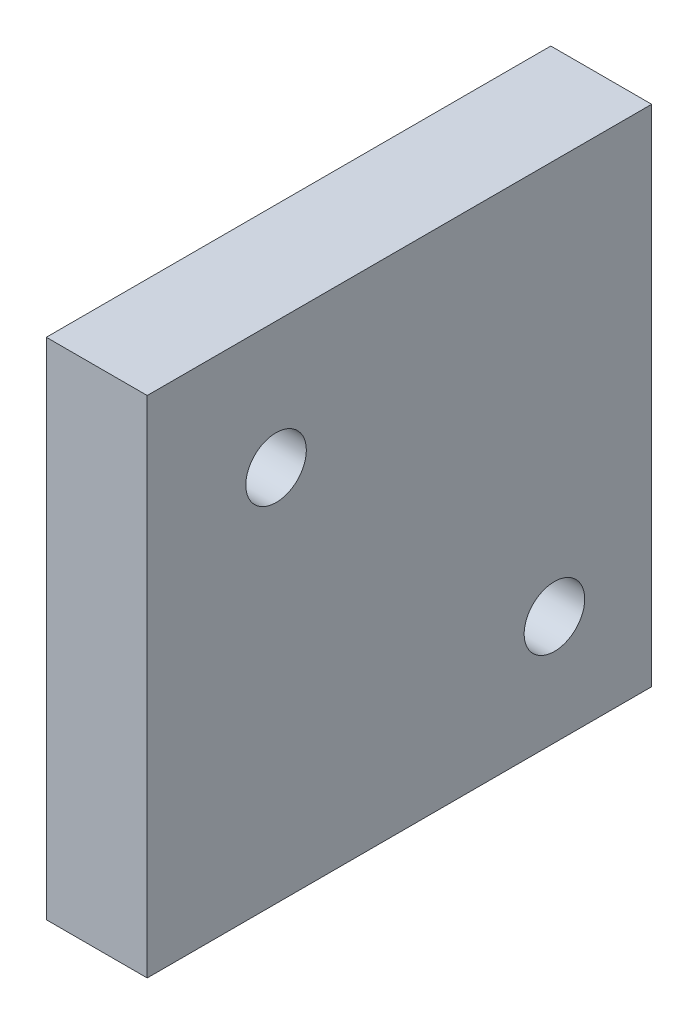
ISO-10303-21;
HEADER;
FILE_DESCRIPTION(('STEP AP214'),'2;1');
FILE_NAME('part.step','',(''),(''),'','','');
FILE_SCHEMA(('AUTOMOTIVE_DESIGN { 1 0 10303 214 1 1 1 1 }'));
ENDSEC;
DATA;
#1=APPLICATION_CONTEXT('core data for automotive mechanical design processes');
#2=APPLICATION_PROTOCOL_DEFINITION('international standard','automotive_design',2000,#1);
#3=PRODUCT_CONTEXT('',#1,'mechanical');
#4=PRODUCT('Part','Part','',(#3));
#5=PRODUCT_RELATED_PRODUCT_CATEGORY('part','',(#4));
#6=PRODUCT_DEFINITION_FORMATION('','',#4);
#7=PRODUCT_DEFINITION_CONTEXT('part definition',#1,'design');
#8=PRODUCT_DEFINITION('design','',#6,#7);
#9=PRODUCT_DEFINITION_SHAPE('','',#8);
#10=(LENGTH_UNIT() NAMED_UNIT(*) SI_UNIT(.MILLI.,.METRE.));
#11=(NAMED_UNIT(*) PLANE_ANGLE_UNIT() SI_UNIT($,.RADIAN.));
#12=(NAMED_UNIT(*) SI_UNIT($,.STERADIAN.) SOLID_ANGLE_UNIT());
#13=UNCERTAINTY_MEASURE_WITH_UNIT(LENGTH_MEASURE(1.E-05),#10,'distance_accuracy_value','');
#14=(GEOMETRIC_REPRESENTATION_CONTEXT(3) GLOBAL_UNCERTAINTY_ASSIGNED_CONTEXT((#13)) GLOBAL_UNIT_ASSIGNED_CONTEXT((#10,
#11,#12)) REPRESENTATION_CONTEXT('',''));
#15=CARTESIAN_POINT('',(0.,0.,0.));
#16=DIRECTION('',(0.,0.,1.));
#17=DIRECTION('',(1.,0.,0.));
#18=AXIS2_PLACEMENT_3D('',#15,#16,#17);
#19=CARTESIAN_POINT('',(20.,-85.8821530326129,54.7445255474453));
#20=DIRECTION('',(0.,1.,0.));
#21=DIRECTION('',(0.,0.,1.));
#22=AXIS2_PLACEMENT_3D('',#19,#20,#21);
#23=PLANE('',#22);
#24=DIRECTION('',(0.,0.,-1.));
#25=VECTOR('',#24,1.);
#26=CARTESIAN_POINT('',(0.,-85.8821530326129,54.7445255474453));
#27=LINE('',#26,#25);
#28=CARTESIAN_POINT('',(0.,-85.8821530326129,54.7445255474453));
#29=VERTEX_POINT('',#28);
#30=CARTESIAN_POINT('',(0.,-85.8821530326129,-45.2554744525548));
#31=VERTEX_POINT('',#30);
#32=EDGE_CURVE('E105',#29,#31,#27,.T.);
#33=ORIENTED_EDGE('',*,*,#32,.T.);
#34=DIRECTION('',(-1.,0.,0.));
#35=VECTOR('',#34,1.);
#36=CARTESIAN_POINT('',(20.,-85.8821530326129,-45.2554744525548));
#37=LINE('',#36,#35);
#38=CARTESIAN_POINT('',(20.,-85.8821530326129,-45.2554744525548));
#39=VERTEX_POINT('',#38);
#40=EDGE_CURVE('E11',#39,#31,#37,.T.);
#41=ORIENTED_EDGE('',*,*,#40,.F.);
#42=DIRECTION('',(0.,0.,-1.));
#43=VECTOR('',#42,1.);
#44=CARTESIAN_POINT('',(20.,-85.8821530326129,54.7445255474453));
#45=LINE('',#44,#43);
#46=CARTESIAN_POINT('',(20.,-85.8821530326129,54.7445255474453));
#47=VERTEX_POINT('',#46);
#48=EDGE_CURVE('E89',#47,#39,#45,.T.);
#49=ORIENTED_EDGE('',*,*,#48,.F.);
#50=DIRECTION('',(-1.,0.,0.));
#51=VECTOR('',#50,1.);
#52=CARTESIAN_POINT('',(20.,-85.8821530326129,54.7445255474453));
#53=LINE('',#52,#51);
#54=EDGE_CURVE('E97',#47,#29,#53,.T.);
#55=ORIENTED_EDGE('',*,*,#54,.T.);
#56=EDGE_LOOP('',(#33,#41,#49,#55));
#57=FACE_BOUND('',#56,.T.);
#58=ADVANCED_FACE('F39',(#57),#23,.F.);
#59=CARTESIAN_POINT('',(20.,-85.8821530326129,-45.2554744525548));
#60=DIRECTION('',(0.,0.,1.));
#61=DIRECTION('',(0.,-1.,0.));
#62=AXIS2_PLACEMENT_3D('',#59,#60,#61);
#63=PLANE('',#62);
#64=DIRECTION('',(0.,1.,0.));
#65=VECTOR('',#64,1.);
#66=CARTESIAN_POINT('',(0.,-85.8821530326129,-45.2554744525548));
#67=LINE('',#66,#65);
#68=CARTESIAN_POINT('',(0.,14.1178469673871,-45.2554744525547));
#69=VERTEX_POINT('',#68);
#70=EDGE_CURVE('E92',#31,#69,#67,.T.);
#71=ORIENTED_EDGE('',*,*,#70,.T.);
#72=DIRECTION('',(-1.,0.,0.));
#73=VECTOR('',#72,1.);
#74=CARTESIAN_POINT('',(20.,14.1178469673871,-45.2554744525547));
#75=LINE('',#74,#73);
#76=CARTESIAN_POINT('',(20.,14.1178469673871,-45.2554744525547));
#77=VERTEX_POINT('',#76);
#78=EDGE_CURVE('E50',#77,#69,#75,.T.);
#79=ORIENTED_EDGE('',*,*,#78,.F.);
#80=DIRECTION('',(0.,1.,0.));
#81=VECTOR('',#80,1.);
#82=CARTESIAN_POINT('',(20.,-85.8821530326129,-45.2554744525548));
#83=LINE('',#82,#81);
#84=EDGE_CURVE('E82',#39,#77,#83,.T.);
#85=ORIENTED_EDGE('',*,*,#84,.F.);
#86=ORIENTED_EDGE('',*,*,#40,.T.);
#87=EDGE_LOOP('',(#71,#79,#85,#86));
#88=FACE_BOUND('',#87,.T.);
#89=ADVANCED_FACE('F93',(#88),#63,.F.);
#90=CARTESIAN_POINT('',(20.,14.1178469673871,54.7445255474453));
#91=DIRECTION('',(0.,-1.,0.));
#92=DIRECTION('',(0.,0.,-1.));
#93=AXIS2_PLACEMENT_3D('',#90,#91,#92);
#94=PLANE('',#93);
#95=DIRECTION('',(0.,0.,1.));
#96=VECTOR('',#95,1.);
#97=CARTESIAN_POINT('',(0.,14.1178469673871,54.7445255474453));
#98=LINE('',#97,#96);
#99=CARTESIAN_POINT('',(0.,14.1178469673871,54.7445255474453));
#100=VERTEX_POINT('',#99);
#101=EDGE_CURVE('E75',#69,#100,#98,.T.);
#102=ORIENTED_EDGE('',*,*,#101,.T.);
#103=DIRECTION('',(-1.,0.,0.));
#104=VECTOR('',#103,1.);
#105=CARTESIAN_POINT('',(20.,14.1178469673871,54.7445255474453));
#106=LINE('',#105,#104);
#107=CARTESIAN_POINT('',(20.,14.1178469673871,54.7445255474453));
#108=VERTEX_POINT('',#107);
#109=EDGE_CURVE('E94',#108,#100,#106,.T.);
#110=ORIENTED_EDGE('',*,*,#109,.F.);
#111=DIRECTION('',(0.,0.,1.));
#112=VECTOR('',#111,1.);
#113=CARTESIAN_POINT('',(20.,14.1178469673871,54.7445255474453));
#114=LINE('',#113,#112);
#115=EDGE_CURVE('E88',#77,#108,#114,.T.);
#116=ORIENTED_EDGE('',*,*,#115,.F.);
#117=ORIENTED_EDGE('',*,*,#78,.T.);
#118=EDGE_LOOP('',(#102,#110,#116,#117));
#119=FACE_BOUND('',#118,.T.);
#120=ADVANCED_FACE('F96',(#119),#94,.F.);
#121=CARTESIAN_POINT('',(20.,-85.8821530326129,54.7445255474453));
#122=DIRECTION('',(0.,0.,-1.));
#123=DIRECTION('',(-1.,0.,0.));
#124=AXIS2_PLACEMENT_3D('',#121,#122,#123);
#125=PLANE('',#124);
#126=DIRECTION('',(0.,-1.,0.));
#127=VECTOR('',#126,1.);
#128=CARTESIAN_POINT('',(0.,-85.8821530326129,54.7445255474453));
#129=LINE('',#128,#127);
#130=EDGE_CURVE('E76',#100,#29,#129,.T.);
#131=ORIENTED_EDGE('',*,*,#130,.T.);
#132=ORIENTED_EDGE('',*,*,#54,.F.);
#133=DIRECTION('',(0.,-1.,0.));
#134=VECTOR('',#133,1.);
#135=CARTESIAN_POINT('',(20.,-85.8821530326129,54.7445255474453));
#136=LINE('',#135,#134);
#137=EDGE_CURVE('E54',#108,#47,#136,.T.);
#138=ORIENTED_EDGE('',*,*,#137,.F.);
#139=ORIENTED_EDGE('',*,*,#109,.T.);
#140=EDGE_LOOP('',(#131,#132,#138,#139));
#141=FACE_BOUND('',#140,.T.);
#142=ADVANCED_FACE('F109',(#141),#125,.F.);
#143=CARTESIAN_POINT('',(20.,0.,0.));
#144=DIRECTION('',(1.,0.,0.));
#145=DIRECTION('',(0.,0.,-1.));
#146=AXIS2_PLACEMENT_3D('',#143,#144,#145);
#147=PLANE('',#146);
#148=CARTESIAN_POINT('',(20.,-11.0342540119711,29.2005018706007));
#149=DIRECTION('',(1.,0.,0.));
#150=DIRECTION('',(0.,0.,-1.));
#151=AXIS2_PLACEMENT_3D('',#148,#149,#150);
#152=CIRCLE('',#151,6.);
#153=CARTESIAN_POINT('',(20.,-11.0342540119711,23.2005018706007));
#154=VERTEX_POINT('',#153);
#155=EDGE_CURVE('E125',#154,#154,#152,.T.);
#156=ORIENTED_EDGE('',*,*,#155,.F.);
#157=EDGE_LOOP('',(#156));
#158=FACE_BOUND('',#157,.T.);
#159=CARTESIAN_POINT('',(20.,-64.1789717911356,-25.9822139354935));
#160=DIRECTION('',(1.,0.,0.));
#161=DIRECTION('',(0.,0.,-1.));
#162=AXIS2_PLACEMENT_3D('',#159,#160,#161);
#163=CIRCLE('',#162,6.);
#164=CARTESIAN_POINT('',(20.,-64.1789717911356,-31.9822139354934));
#165=VERTEX_POINT('',#164);
#166=EDGE_CURVE('E116',#165,#165,#163,.T.);
#167=ORIENTED_EDGE('',*,*,#166,.F.);
#168=EDGE_LOOP('',(#167));
#169=FACE_BOUND('',#168,.T.);
#170=ORIENTED_EDGE('',*,*,#48,.T.);
#171=ORIENTED_EDGE('',*,*,#84,.T.);
#172=ORIENTED_EDGE('',*,*,#115,.T.);
#173=ORIENTED_EDGE('',*,*,#137,.T.);
#174=EDGE_LOOP('',(#170,#171,#172,#173));
#175=FACE_BOUND('',#174,.T.);
#176=ADVANCED_FACE('F86',(#158,#169,#175),#147,.T.);
#177=CARTESIAN_POINT('',(0.,0.,0.));
#178=DIRECTION('',(1.,0.,0.));
#179=DIRECTION('',(0.,0.,-1.));
#180=AXIS2_PLACEMENT_3D('',#177,#178,#179);
#181=PLANE('',#180);
#182=CARTESIAN_POINT('',(0.,-11.0342540119711,29.2005018706007));
#183=DIRECTION('',(1.,0.,0.));
#184=DIRECTION('',(0.,0.,-1.));
#185=AXIS2_PLACEMENT_3D('',#182,#183,#184);
#186=CIRCLE('',#185,6.);
#187=CARTESIAN_POINT('',(0.,-11.0342540119711,23.2005018706007));
#188=VERTEX_POINT('',#187);
#189=EDGE_CURVE('E123',#188,#188,#186,.T.);
#190=ORIENTED_EDGE('',*,*,#189,.T.);
#191=EDGE_LOOP('',(#190));
#192=FACE_BOUND('',#191,.T.);
#193=CARTESIAN_POINT('',(0.,-64.1789717911356,-25.9822139354935));
#194=DIRECTION('',(1.,0.,0.));
#195=DIRECTION('',(0.,0.,-1.));
#196=AXIS2_PLACEMENT_3D('',#193,#194,#195);
#197=CIRCLE('',#196,6.);
#198=CARTESIAN_POINT('',(0.,-64.1789717911356,-31.9822139354934));
#199=VERTEX_POINT('',#198);
#200=EDGE_CURVE('E103',#199,#199,#197,.T.);
#201=ORIENTED_EDGE('',*,*,#200,.T.);
#202=EDGE_LOOP('',(#201));
#203=FACE_BOUND('',#202,.T.);
#204=ORIENTED_EDGE('',*,*,#32,.F.);
#205=ORIENTED_EDGE('',*,*,#130,.F.);
#206=ORIENTED_EDGE('',*,*,#101,.F.);
#207=ORIENTED_EDGE('',*,*,#70,.F.);
#208=EDGE_LOOP('',(#204,#205,#206,#207));
#209=FACE_BOUND('',#208,.T.);
#210=ADVANCED_FACE('F111',(#192,#203,#209),#181,.F.);
#211=CARTESIAN_POINT('',(20.,-64.1789717911356,-25.9822139354935));
#212=DIRECTION('',(1.,0.,0.));
#213=DIRECTION('',(0.,0.,-1.));
#214=AXIS2_PLACEMENT_3D('',#211,#212,#213);
#215=CYLINDRICAL_SURFACE('',#214,6.);
#216=ORIENTED_EDGE('',*,*,#200,.F.);
#217=EDGE_LOOP('',(#216));
#218=FACE_BOUND('',#217,.T.);
#219=ORIENTED_EDGE('',*,*,#166,.T.);
#220=EDGE_LOOP('',(#219));
#221=FACE_BOUND('',#220,.T.);
#222=ADVANCED_FACE('F134',(#218,#221),#215,.F.);
#223=CARTESIAN_POINT('',(20.,-11.0342540119711,29.2005018706007));
#224=DIRECTION('',(1.,0.,0.));
#225=DIRECTION('',(0.,0.,-1.));
#226=AXIS2_PLACEMENT_3D('',#223,#224,#225);
#227=CYLINDRICAL_SURFACE('',#226,6.);
#228=ORIENTED_EDGE('',*,*,#189,.F.);
#229=EDGE_LOOP('',(#228));
#230=FACE_BOUND('',#229,.T.);
#231=ORIENTED_EDGE('',*,*,#155,.T.);
#232=EDGE_LOOP('',(#231));
#233=FACE_BOUND('',#232,.T.);
#234=ADVANCED_FACE('F126',(#230,#233),#227,.F.);
#235=CLOSED_SHELL('',(#58,#89,#120,#142,#176,#210,#222,#234));
#236=MANIFOLD_SOLID_BREP('B2',#235);
#237=ADVANCED_BREP_SHAPE_REPRESENTATION('',(#18,#236),#14);
#238=SHAPE_DEFINITION_REPRESENTATION(#9,#237);
ENDSEC;
END-ISO-10303-21;
